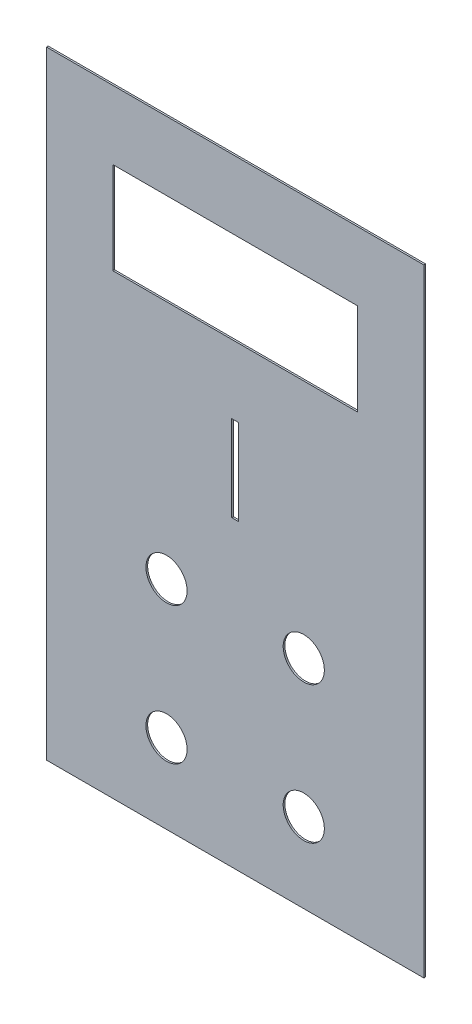
ISO-10303-21;
HEADER;
FILE_DESCRIPTION(('STEP AP214'),'2;1');
FILE_NAME('part.step','',(''),(''),'','','');
FILE_SCHEMA(('AUTOMOTIVE_DESIGN { 1 0 10303 214 1 1 1 1 }'));
ENDSEC;
DATA;
#1=APPLICATION_CONTEXT('core data for automotive mechanical design processes');
#2=APPLICATION_PROTOCOL_DEFINITION('international standard','automotive_design',2000,#1);
#3=PRODUCT_CONTEXT('',#1,'mechanical');
#4=PRODUCT('Part','Part','',(#3));
#5=PRODUCT_RELATED_PRODUCT_CATEGORY('part','',(#4));
#6=PRODUCT_DEFINITION_FORMATION('','',#4);
#7=PRODUCT_DEFINITION_CONTEXT('part definition',#1,'design');
#8=PRODUCT_DEFINITION('design','',#6,#7);
#9=PRODUCT_DEFINITION_SHAPE('','',#8);
#10=(LENGTH_UNIT() NAMED_UNIT(*) SI_UNIT(.MILLI.,.METRE.));
#11=(NAMED_UNIT(*) PLANE_ANGLE_UNIT() SI_UNIT($,.RADIAN.));
#12=(NAMED_UNIT(*) SI_UNIT($,.STERADIAN.) SOLID_ANGLE_UNIT());
#13=UNCERTAINTY_MEASURE_WITH_UNIT(LENGTH_MEASURE(1.E-05),#10,'distance_accuracy_value','');
#14=(GEOMETRIC_REPRESENTATION_CONTEXT(3) GLOBAL_UNCERTAINTY_ASSIGNED_CONTEXT((#13)) GLOBAL_UNIT_ASSIGNED_CONTEXT((#10,
#11,#12)) REPRESENTATION_CONTEXT('',''));
#15=CARTESIAN_POINT('',(0.,0.,0.));
#16=DIRECTION('',(0.,0.,1.));
#17=DIRECTION('',(1.,0.,0.));
#18=AXIS2_PLACEMENT_3D('',#15,#16,#17);
#19=CARTESIAN_POINT('',(55.,-90.,0.5));
#20=DIRECTION('',(-1.,0.,0.));
#21=DIRECTION('',(0.,0.,1.));
#22=AXIS2_PLACEMENT_3D('',#19,#20,#21);
#23=PLANE('',#22);
#24=DIRECTION('',(0.,1.,0.));
#25=VECTOR('',#24,1.);
#26=CARTESIAN_POINT('',(55.,-90.,0.));
#27=LINE('',#26,#25);
#28=CARTESIAN_POINT('',(55.,-90.,0.));
#29=VERTEX_POINT('',#28);
#30=CARTESIAN_POINT('',(55.,90.,0.));
#31=VERTEX_POINT('',#30);
#32=EDGE_CURVE('E175',#29,#31,#27,.T.);
#33=ORIENTED_EDGE('',*,*,#32,.T.);
#34=DIRECTION('',(0.,0.,-1.));
#35=VECTOR('',#34,1.);
#36=CARTESIAN_POINT('',(55.,90.,0.5));
#37=LINE('',#36,#35);
#38=CARTESIAN_POINT('',(55.,90.,0.5));
#39=VERTEX_POINT('',#38);
#40=EDGE_CURVE('E11',#39,#31,#37,.T.);
#41=ORIENTED_EDGE('',*,*,#40,.F.);
#42=DIRECTION('',(0.,1.,0.));
#43=VECTOR('',#42,1.);
#44=CARTESIAN_POINT('',(55.,-90.,0.5));
#45=LINE('',#44,#43);
#46=CARTESIAN_POINT('',(55.,-90.,0.5));
#47=VERTEX_POINT('',#46);
#48=EDGE_CURVE('E253',#47,#39,#45,.T.);
#49=ORIENTED_EDGE('',*,*,#48,.F.);
#50=DIRECTION('',(0.,0.,-1.));
#51=VECTOR('',#50,1.);
#52=CARTESIAN_POINT('',(55.,-90.,0.5));
#53=LINE('',#52,#51);
#54=EDGE_CURVE('E267',#47,#29,#53,.T.);
#55=ORIENTED_EDGE('',*,*,#54,.T.);
#56=EDGE_LOOP('',(#33,#41,#49,#55));
#57=FACE_BOUND('',#56,.T.);
#58=ADVANCED_FACE('F38',(#57),#23,.F.);
#59=CARTESIAN_POINT('',(-55.,90.,0.5));
#60=DIRECTION('',(0.,-1.,0.));
#61=DIRECTION('',(0.,0.,-1.));
#62=AXIS2_PLACEMENT_3D('',#59,#60,#61);
#63=PLANE('',#62);
#64=DIRECTION('',(-1.,0.,0.));
#65=VECTOR('',#64,1.);
#66=CARTESIAN_POINT('',(-55.,90.,0.));
#67=LINE('',#66,#65);
#68=CARTESIAN_POINT('',(-55.,90.,0.));
#69=VERTEX_POINT('',#68);
#70=EDGE_CURVE('E271',#31,#69,#67,.T.);
#71=ORIENTED_EDGE('',*,*,#70,.T.);
#72=DIRECTION('',(0.,0.,-1.));
#73=VECTOR('',#72,1.);
#74=CARTESIAN_POINT('',(-55.,90.,0.5));
#75=LINE('',#74,#73);
#76=CARTESIAN_POINT('',(-55.,90.,0.5));
#77=VERTEX_POINT('',#76);
#78=EDGE_CURVE('E46',#77,#69,#75,.T.);
#79=ORIENTED_EDGE('',*,*,#78,.F.);
#80=DIRECTION('',(-1.,0.,0.));
#81=VECTOR('',#80,1.);
#82=CARTESIAN_POINT('',(-55.,90.,0.5));
#83=LINE('',#82,#81);
#84=EDGE_CURVE('E257',#39,#77,#83,.T.);
#85=ORIENTED_EDGE('',*,*,#84,.F.);
#86=ORIENTED_EDGE('',*,*,#40,.T.);
#87=EDGE_LOOP('',(#71,#79,#85,#86));
#88=FACE_BOUND('',#87,.T.);
#89=ADVANCED_FACE('F306',(#88),#63,.F.);
#90=CARTESIAN_POINT('',(-55.,-90.,0.5));
#91=DIRECTION('',(1.,0.,0.));
#92=DIRECTION('',(0.,0.,-1.));
#93=AXIS2_PLACEMENT_3D('',#90,#91,#92);
#94=PLANE('',#93);
#95=DIRECTION('',(0.,-1.,0.));
#96=VECTOR('',#95,1.);
#97=CARTESIAN_POINT('',(-55.,-90.,0.));
#98=LINE('',#97,#96);
#99=CARTESIAN_POINT('',(-55.,-90.,0.));
#100=VERTEX_POINT('',#99);
#101=EDGE_CURVE('E274',#69,#100,#98,.T.);
#102=ORIENTED_EDGE('',*,*,#101,.T.);
#103=DIRECTION('',(0.,0.,-1.));
#104=VECTOR('',#103,1.);
#105=CARTESIAN_POINT('',(-55.,-90.,0.5));
#106=LINE('',#105,#104);
#107=CARTESIAN_POINT('',(-55.,-90.,0.5));
#108=VERTEX_POINT('',#107);
#109=EDGE_CURVE('E282',#108,#100,#106,.T.);
#110=ORIENTED_EDGE('',*,*,#109,.F.);
#111=DIRECTION('',(0.,-1.,0.));
#112=VECTOR('',#111,1.);
#113=CARTESIAN_POINT('',(-55.,-90.,0.5));
#114=LINE('',#113,#112);
#115=EDGE_CURVE('E261',#77,#108,#114,.T.);
#116=ORIENTED_EDGE('',*,*,#115,.F.);
#117=ORIENTED_EDGE('',*,*,#78,.T.);
#118=EDGE_LOOP('',(#102,#110,#116,#117));
#119=FACE_BOUND('',#118,.T.);
#120=ADVANCED_FACE('F291',(#119),#94,.F.);
#121=CARTESIAN_POINT('',(-55.,-90.,0.5));
#122=DIRECTION('',(0.,1.,0.));
#123=DIRECTION('',(0.,0.,1.));
#124=AXIS2_PLACEMENT_3D('',#121,#122,#123);
#125=PLANE('',#124);
#126=DIRECTION('',(1.,0.,0.));
#127=VECTOR('',#126,1.);
#128=CARTESIAN_POINT('',(-55.,-90.,0.));
#129=LINE('',#128,#127);
#130=EDGE_CURVE('E258',#100,#29,#129,.T.);
#131=ORIENTED_EDGE('',*,*,#130,.T.);
#132=ORIENTED_EDGE('',*,*,#54,.F.);
#133=DIRECTION('',(1.,0.,0.));
#134=VECTOR('',#133,1.);
#135=CARTESIAN_POINT('',(-55.,-90.,0.5));
#136=LINE('',#135,#134);
#137=EDGE_CURVE('E264',#108,#47,#136,.T.);
#138=ORIENTED_EDGE('',*,*,#137,.F.);
#139=ORIENTED_EDGE('',*,*,#109,.T.);
#140=EDGE_LOOP('',(#131,#132,#138,#139));
#141=FACE_BOUND('',#140,.T.);
#142=ADVANCED_FACE('F299',(#141),#125,.F.);
#143=CARTESIAN_POINT('',(0.,0.,0.5));
#144=DIRECTION('',(0.,0.,-1.));
#145=DIRECTION('',(-1.,0.,0.));
#146=AXIS2_PLACEMENT_3D('',#143,#144,#145);
#147=PLANE('',#146);
#148=DIRECTION('',(-1.,0.,0.));
#149=VECTOR('',#148,1.);
#150=CARTESIAN_POINT('',(-35.65,70.,0.5));
#151=LINE('',#150,#149);
#152=CARTESIAN_POINT('',(35.65,70.,0.5));
#153=VERTEX_POINT('',#152);
#154=CARTESIAN_POINT('',(-35.65,70.,0.5));
#155=VERTEX_POINT('',#154);
#156=EDGE_CURVE('E165',#153,#155,#151,.T.);
#157=ORIENTED_EDGE('',*,*,#156,.F.);
#158=DIRECTION('',(0.,1.,0.));
#159=VECTOR('',#158,1.);
#160=CARTESIAN_POINT('',(35.65,43.2,0.5));
#161=LINE('',#160,#159);
#162=CARTESIAN_POINT('',(35.65,43.2,0.5));
#163=VERTEX_POINT('',#162);
#164=EDGE_CURVE('E53',#163,#153,#161,.T.);
#165=ORIENTED_EDGE('',*,*,#164,.F.);
#166=DIRECTION('',(1.,0.,0.));
#167=VECTOR('',#166,1.);
#168=CARTESIAN_POINT('',(-35.65,43.2,0.5));
#169=LINE('',#168,#167);
#170=CARTESIAN_POINT('',(-35.65,43.2,0.5));
#171=VERTEX_POINT('',#170);
#172=EDGE_CURVE('E151',#171,#163,#169,.T.);
#173=ORIENTED_EDGE('',*,*,#172,.F.);
#174=DIRECTION('',(0.,-1.,0.));
#175=VECTOR('',#174,1.);
#176=CARTESIAN_POINT('',(-35.65,43.2,0.5));
#177=LINE('',#176,#175);
#178=EDGE_CURVE('E156',#155,#171,#177,.T.);
#179=ORIENTED_EDGE('',*,*,#178,.F.);
#180=EDGE_LOOP('',(#157,#165,#173,#179));
#181=FACE_BOUND('',#180,.T.);
#182=CARTESIAN_POINT('',(-20.,-66.8,0.5));
#183=DIRECTION('',(0.,0.,1.));
#184=DIRECTION('',(1.,0.,0.));
#185=AXIS2_PLACEMENT_3D('',#182,#183,#184);
#186=CIRCLE('',#185,6.00000000000001);
#187=CARTESIAN_POINT('',(-14.,-66.8,0.5));
#188=VERTEX_POINT('',#187);
#189=EDGE_CURVE('E186',#188,#188,#186,.T.);
#190=ORIENTED_EDGE('',*,*,#189,.F.);
#191=EDGE_LOOP('',(#190));
#192=FACE_BOUND('',#191,.T.);
#193=CARTESIAN_POINT('',(20.,-66.8,0.5));
#194=DIRECTION('',(0.,0.,1.));
#195=DIRECTION('',(1.,0.,0.));
#196=AXIS2_PLACEMENT_3D('',#193,#194,#195);
#197=CIRCLE('',#196,6.);
#198=CARTESIAN_POINT('',(26.,-66.8,0.5));
#199=VERTEX_POINT('',#198);
#200=EDGE_CURVE('E185',#199,#199,#197,.T.);
#201=ORIENTED_EDGE('',*,*,#200,.F.);
#202=EDGE_LOOP('',(#201));
#203=FACE_BOUND('',#202,.T.);
#204=CARTESIAN_POINT('',(20.,-26.8,0.5));
#205=DIRECTION('',(0.,0.,1.));
#206=DIRECTION('',(1.,0.,0.));
#207=AXIS2_PLACEMENT_3D('',#204,#205,#206);
#208=CIRCLE('',#207,6.);
#209=CARTESIAN_POINT('',(26.,-26.8,0.5));
#210=VERTEX_POINT('',#209);
#211=EDGE_CURVE('E243',#210,#210,#208,.T.);
#212=ORIENTED_EDGE('',*,*,#211,.F.);
#213=EDGE_LOOP('',(#212));
#214=FACE_BOUND('',#213,.T.);
#215=CARTESIAN_POINT('',(-20.,-26.8,0.5));
#216=DIRECTION('',(0.,0.,1.));
#217=DIRECTION('',(1.,0.,0.));
#218=AXIS2_PLACEMENT_3D('',#215,#216,#217);
#219=CIRCLE('',#218,6.);
#220=CARTESIAN_POINT('',(-14.,-26.8,0.5));
#221=VERTEX_POINT('',#220);
#222=EDGE_CURVE('E235',#221,#221,#219,.T.);
#223=ORIENTED_EDGE('',*,*,#222,.F.);
#224=EDGE_LOOP('',(#223));
#225=FACE_BOUND('',#224,.T.);
#226=DIRECTION('',(-1.,0.,0.));
#227=VECTOR('',#226,1.);
#228=CARTESIAN_POINT('',(-0.999999999999993,23.2,0.5));
#229=LINE('',#228,#227);
#230=CARTESIAN_POINT('',(1.00000000000001,23.2,0.5));
#231=VERTEX_POINT('',#230);
#232=CARTESIAN_POINT('',(-0.999999999999993,23.2,0.5));
#233=VERTEX_POINT('',#232);
#234=EDGE_CURVE('E210',#231,#233,#229,.T.);
#235=ORIENTED_EDGE('',*,*,#234,.F.);
#236=DIRECTION('',(0.,1.,0.));
#237=VECTOR('',#236,1.);
#238=CARTESIAN_POINT('',(1.00000000000001,-1.8,0.5));
#239=LINE('',#238,#237);
#240=CARTESIAN_POINT('',(1.00000000000001,-1.8,0.5));
#241=VERTEX_POINT('',#240);
#242=EDGE_CURVE('E61',#241,#231,#239,.T.);
#243=ORIENTED_EDGE('',*,*,#242,.F.);
#244=DIRECTION('',(1.,0.,0.));
#245=VECTOR('',#244,1.);
#246=CARTESIAN_POINT('',(-0.999999999999993,-1.8,0.5));
#247=LINE('',#246,#245);
#248=CARTESIAN_POINT('',(-0.999999999999993,-1.8,0.5));
#249=VERTEX_POINT('',#248);
#250=EDGE_CURVE('E195',#249,#241,#247,.T.);
#251=ORIENTED_EDGE('',*,*,#250,.F.);
#252=DIRECTION('',(0.,-1.,0.));
#253=VECTOR('',#252,1.);
#254=CARTESIAN_POINT('',(-0.999999999999993,-1.8,0.5));
#255=LINE('',#254,#253);
#256=EDGE_CURVE('E215',#233,#249,#255,.T.);
#257=ORIENTED_EDGE('',*,*,#256,.F.);
#258=EDGE_LOOP('',(#235,#243,#251,#257));
#259=FACE_BOUND('',#258,.T.);
#260=ORIENTED_EDGE('',*,*,#48,.T.);
#261=ORIENTED_EDGE('',*,*,#84,.T.);
#262=ORIENTED_EDGE('',*,*,#115,.T.);
#263=ORIENTED_EDGE('',*,*,#137,.T.);
#264=EDGE_LOOP('',(#260,#261,#262,#263));
#265=FACE_BOUND('',#264,.T.);
#266=ADVANCED_FACE('F305',(#181,#192,#203,#214,#225,#259,#265),#147,.F.);
#267=CARTESIAN_POINT('',(0.,0.,0.));
#268=DIRECTION('',(0.,0.,-1.));
#269=DIRECTION('',(-1.,0.,0.));
#270=AXIS2_PLACEMENT_3D('',#267,#268,#269);
#271=PLANE('',#270);
#272=DIRECTION('',(0.,1.,0.));
#273=VECTOR('',#272,1.);
#274=CARTESIAN_POINT('',(35.65,43.2,0.));
#275=LINE('',#274,#273);
#276=CARTESIAN_POINT('',(35.65,43.2,0.));
#277=VERTEX_POINT('',#276);
#278=CARTESIAN_POINT('',(35.65,70.,0.));
#279=VERTEX_POINT('',#278);
#280=EDGE_CURVE('E129',#277,#279,#275,.T.);
#281=ORIENTED_EDGE('',*,*,#280,.T.);
#282=DIRECTION('',(-1.,0.,0.));
#283=VECTOR('',#282,1.);
#284=CARTESIAN_POINT('',(-35.65,70.,0.));
#285=LINE('',#284,#283);
#286=CARTESIAN_POINT('',(-35.65,70.,0.));
#287=VERTEX_POINT('',#286);
#288=EDGE_CURVE('E140',#279,#287,#285,.T.);
#289=ORIENTED_EDGE('',*,*,#288,.T.);
#290=DIRECTION('',(0.,-1.,0.));
#291=VECTOR('',#290,1.);
#292=CARTESIAN_POINT('',(-35.65,43.2,0.));
#293=LINE('',#292,#291);
#294=CARTESIAN_POINT('',(-35.65,43.2,0.));
#295=VERTEX_POINT('',#294);
#296=EDGE_CURVE('E145',#287,#295,#293,.T.);
#297=ORIENTED_EDGE('',*,*,#296,.T.);
#298=DIRECTION('',(1.,0.,0.));
#299=VECTOR('',#298,1.);
#300=CARTESIAN_POINT('',(-35.65,43.2,0.));
#301=LINE('',#300,#299);
#302=EDGE_CURVE('E136',#295,#277,#301,.T.);
#303=ORIENTED_EDGE('',*,*,#302,.T.);
#304=EDGE_LOOP('',(#281,#289,#297,#303));
#305=FACE_BOUND('',#304,.T.);
#306=CARTESIAN_POINT('',(-20.,-66.8,0.));
#307=DIRECTION('',(0.,0.,1.));
#308=DIRECTION('',(1.,0.,0.));
#309=AXIS2_PLACEMENT_3D('',#306,#307,#308);
#310=CIRCLE('',#309,6.00000000000001);
#311=CARTESIAN_POINT('',(-14.,-66.8,0.));
#312=VERTEX_POINT('',#311);
#313=EDGE_CURVE('E181',#312,#312,#310,.T.);
#314=ORIENTED_EDGE('',*,*,#313,.T.);
#315=EDGE_LOOP('',(#314));
#316=FACE_BOUND('',#315,.T.);
#317=CARTESIAN_POINT('',(20.,-66.8,0.));
#318=DIRECTION('',(0.,0.,1.));
#319=DIRECTION('',(1.,0.,0.));
#320=AXIS2_PLACEMENT_3D('',#317,#318,#319);
#321=CIRCLE('',#320,6.);
#322=CARTESIAN_POINT('',(26.,-66.8,0.));
#323=VERTEX_POINT('',#322);
#324=EDGE_CURVE('E247',#323,#323,#321,.T.);
#325=ORIENTED_EDGE('',*,*,#324,.T.);
#326=EDGE_LOOP('',(#325));
#327=FACE_BOUND('',#326,.T.);
#328=CARTESIAN_POINT('',(20.,-26.8,0.));
#329=DIRECTION('',(0.,0.,1.));
#330=DIRECTION('',(1.,0.,0.));
#331=AXIS2_PLACEMENT_3D('',#328,#329,#330);
#332=CIRCLE('',#331,6.);
#333=CARTESIAN_POINT('',(26.,-26.8,0.));
#334=VERTEX_POINT('',#333);
#335=EDGE_CURVE('E239',#334,#334,#332,.T.);
#336=ORIENTED_EDGE('',*,*,#335,.T.);
#337=EDGE_LOOP('',(#336));
#338=FACE_BOUND('',#337,.T.);
#339=CARTESIAN_POINT('',(-20.,-26.8,0.));
#340=DIRECTION('',(0.,0.,1.));
#341=DIRECTION('',(1.,0.,0.));
#342=AXIS2_PLACEMENT_3D('',#339,#340,#341);
#343=CIRCLE('',#342,6.);
#344=CARTESIAN_POINT('',(-14.,-26.8,0.));
#345=VERTEX_POINT('',#344);
#346=EDGE_CURVE('E211',#345,#345,#343,.T.);
#347=ORIENTED_EDGE('',*,*,#346,.T.);
#348=EDGE_LOOP('',(#347));
#349=FACE_BOUND('',#348,.T.);
#350=DIRECTION('',(0.,1.,0.));
#351=VECTOR('',#350,1.);
#352=CARTESIAN_POINT('',(1.00000000000001,-1.8,0.));
#353=LINE('',#352,#351);
#354=CARTESIAN_POINT('',(1.00000000000001,-1.8,0.));
#355=VERTEX_POINT('',#354);
#356=CARTESIAN_POINT('',(1.00000000000001,23.2,0.));
#357=VERTEX_POINT('',#356);
#358=EDGE_CURVE('E190',#355,#357,#353,.T.);
#359=ORIENTED_EDGE('',*,*,#358,.T.);
#360=DIRECTION('',(-1.,0.,0.));
#361=VECTOR('',#360,1.);
#362=CARTESIAN_POINT('',(-0.999999999999993,23.2,0.));
#363=LINE('',#362,#361);
#364=CARTESIAN_POINT('',(-0.999999999999993,23.2,0.));
#365=VERTEX_POINT('',#364);
#366=EDGE_CURVE('E194',#357,#365,#363,.T.);
#367=ORIENTED_EDGE('',*,*,#366,.T.);
#368=DIRECTION('',(0.,-1.,0.));
#369=VECTOR('',#368,1.);
#370=CARTESIAN_POINT('',(-0.999999999999993,-1.8,0.));
#371=LINE('',#370,#369);
#372=CARTESIAN_POINT('',(-0.999999999999993,-1.8,0.));
#373=VERTEX_POINT('',#372);
#374=EDGE_CURVE('E199',#365,#373,#371,.T.);
#375=ORIENTED_EDGE('',*,*,#374,.T.);
#376=DIRECTION('',(1.,0.,0.));
#377=VECTOR('',#376,1.);
#378=CARTESIAN_POINT('',(-0.999999999999993,-1.8,0.));
#379=LINE('',#378,#377);
#380=EDGE_CURVE('E203',#373,#355,#379,.T.);
#381=ORIENTED_EDGE('',*,*,#380,.T.);
#382=EDGE_LOOP('',(#359,#367,#375,#381));
#383=FACE_BOUND('',#382,.T.);
#384=ORIENTED_EDGE('',*,*,#32,.F.);
#385=ORIENTED_EDGE('',*,*,#130,.F.);
#386=ORIENTED_EDGE('',*,*,#101,.F.);
#387=ORIENTED_EDGE('',*,*,#70,.F.);
#388=EDGE_LOOP('',(#384,#385,#386,#387));
#389=FACE_BOUND('',#388,.T.);
#390=ADVANCED_FACE('F147',(#305,#316,#327,#338,#349,#383,#389),#271,.T.);
#391=CARTESIAN_POINT('',(1.00000000000001,-1.8,0.));
#392=DIRECTION('',(1.,0.,0.));
#393=DIRECTION('',(0.,0.,-1.));
#394=AXIS2_PLACEMENT_3D('',#391,#392,#393);
#395=PLANE('',#394);
#396=ORIENTED_EDGE('',*,*,#242,.T.);
#397=DIRECTION('',(0.,0.,1.));
#398=VECTOR('',#397,1.);
#399=CARTESIAN_POINT('',(1.00000000000001,23.2,0.));
#400=LINE('',#399,#398);
#401=EDGE_CURVE('E207',#357,#231,#400,.T.);
#402=ORIENTED_EDGE('',*,*,#401,.F.);
#403=ORIENTED_EDGE('',*,*,#358,.F.);
#404=DIRECTION('',(0.,0.,1.));
#405=VECTOR('',#404,1.);
#406=CARTESIAN_POINT('',(1.00000000000001,-1.8,0.));
#407=LINE('',#406,#405);
#408=EDGE_CURVE('E166',#355,#241,#407,.T.);
#409=ORIENTED_EDGE('',*,*,#408,.T.);
#410=EDGE_LOOP('',(#396,#402,#403,#409));
#411=FACE_BOUND('',#410,.T.);
#412=ADVANCED_FACE('F318',(#411),#395,.F.);
#413=CARTESIAN_POINT('',(-0.999999999999993,-1.8,0.));
#414=DIRECTION('',(0.,-1.,0.));
#415=DIRECTION('',(0.,0.,-1.));
#416=AXIS2_PLACEMENT_3D('',#413,#414,#415);
#417=PLANE('',#416);
#418=ORIENTED_EDGE('',*,*,#250,.T.);
#419=ORIENTED_EDGE('',*,*,#408,.F.);
#420=ORIENTED_EDGE('',*,*,#380,.F.);
#421=DIRECTION('',(0.,0.,1.));
#422=VECTOR('',#421,1.);
#423=CARTESIAN_POINT('',(-0.999999999999993,-1.8,0.));
#424=LINE('',#423,#422);
#425=EDGE_CURVE('E224',#373,#249,#424,.T.);
#426=ORIENTED_EDGE('',*,*,#425,.T.);
#427=EDGE_LOOP('',(#418,#419,#420,#426));
#428=FACE_BOUND('',#427,.T.);
#429=ADVANCED_FACE('F338',(#428),#417,.F.);
#430=CARTESIAN_POINT('',(-0.999999999999993,-1.8,0.));
#431=DIRECTION('',(-1.,0.,0.));
#432=DIRECTION('',(0.,0.,1.));
#433=AXIS2_PLACEMENT_3D('',#430,#431,#432);
#434=PLANE('',#433);
#435=ORIENTED_EDGE('',*,*,#256,.T.);
#436=ORIENTED_EDGE('',*,*,#425,.F.);
#437=ORIENTED_EDGE('',*,*,#374,.F.);
#438=DIRECTION('',(0.,0.,1.));
#439=VECTOR('',#438,1.);
#440=CARTESIAN_POINT('',(-0.999999999999993,23.2,0.));
#441=LINE('',#440,#439);
#442=EDGE_CURVE('E227',#365,#233,#441,.T.);
#443=ORIENTED_EDGE('',*,*,#442,.T.);
#444=EDGE_LOOP('',(#435,#436,#437,#443));
#445=FACE_BOUND('',#444,.T.);
#446=ADVANCED_FACE('F341',(#445),#434,.F.);
#447=CARTESIAN_POINT('',(-0.999999999999993,23.2,0.));
#448=DIRECTION('',(0.,1.,0.));
#449=DIRECTION('',(0.,0.,1.));
#450=AXIS2_PLACEMENT_3D('',#447,#448,#449);
#451=PLANE('',#450);
#452=ORIENTED_EDGE('',*,*,#234,.T.);
#453=ORIENTED_EDGE('',*,*,#442,.F.);
#454=ORIENTED_EDGE('',*,*,#366,.F.);
#455=ORIENTED_EDGE('',*,*,#401,.T.);
#456=EDGE_LOOP('',(#452,#453,#454,#455));
#457=FACE_BOUND('',#456,.T.);
#458=ADVANCED_FACE('F334',(#457),#451,.F.);
#459=CARTESIAN_POINT('',(-20.,-26.8,0.));
#460=DIRECTION('',(0.,0.,1.));
#461=DIRECTION('',(1.,0.,0.));
#462=AXIS2_PLACEMENT_3D('',#459,#460,#461);
#463=CYLINDRICAL_SURFACE('',#462,6.);
#464=ORIENTED_EDGE('',*,*,#346,.F.);
#465=EDGE_LOOP('',(#464));
#466=FACE_BOUND('',#465,.T.);
#467=ORIENTED_EDGE('',*,*,#222,.T.);
#468=EDGE_LOOP('',(#467));
#469=FACE_BOUND('',#468,.T.);
#470=ADVANCED_FACE('F330',(#466,#469),#463,.F.);
#471=CARTESIAN_POINT('',(20.,-26.8,0.));
#472=DIRECTION('',(0.,0.,1.));
#473=DIRECTION('',(1.,0.,0.));
#474=AXIS2_PLACEMENT_3D('',#471,#472,#473);
#475=CYLINDRICAL_SURFACE('',#474,6.);
#476=ORIENTED_EDGE('',*,*,#335,.F.);
#477=EDGE_LOOP('',(#476));
#478=FACE_BOUND('',#477,.T.);
#479=ORIENTED_EDGE('',*,*,#211,.T.);
#480=EDGE_LOOP('',(#479));
#481=FACE_BOUND('',#480,.T.);
#482=ADVANCED_FACE('F326',(#478,#481),#475,.F.);
#483=CARTESIAN_POINT('',(20.,-66.8,0.));
#484=DIRECTION('',(0.,0.,1.));
#485=DIRECTION('',(1.,0.,0.));
#486=AXIS2_PLACEMENT_3D('',#483,#484,#485);
#487=CYLINDRICAL_SURFACE('',#486,6.);
#488=ORIENTED_EDGE('',*,*,#324,.F.);
#489=EDGE_LOOP('',(#488));
#490=FACE_BOUND('',#489,.T.);
#491=ORIENTED_EDGE('',*,*,#200,.T.);
#492=EDGE_LOOP('',(#491));
#493=FACE_BOUND('',#492,.T.);
#494=ADVANCED_FACE('F322',(#490,#493),#487,.F.);
#495=CARTESIAN_POINT('',(-20.,-66.8,0.));
#496=DIRECTION('',(0.,0.,1.));
#497=DIRECTION('',(1.,0.,0.));
#498=AXIS2_PLACEMENT_3D('',#495,#496,#497);
#499=CYLINDRICAL_SURFACE('',#498,6.00000000000001);
#500=ORIENTED_EDGE('',*,*,#313,.F.);
#501=EDGE_LOOP('',(#500));
#502=FACE_BOUND('',#501,.T.);
#503=ORIENTED_EDGE('',*,*,#189,.T.);
#504=EDGE_LOOP('',(#503));
#505=FACE_BOUND('',#504,.T.);
#506=ADVANCED_FACE('F325',(#502,#505),#499,.F.);
#507=CARTESIAN_POINT('',(35.65,43.2,0.));
#508=DIRECTION('',(1.,0.,0.));
#509=DIRECTION('',(0.,0.,-1.));
#510=AXIS2_PLACEMENT_3D('',#507,#508,#509);
#511=PLANE('',#510);
#512=ORIENTED_EDGE('',*,*,#164,.T.);
#513=DIRECTION('',(0.,0.,1.));
#514=VECTOR('',#513,1.);
#515=CARTESIAN_POINT('',(35.65,70.,0.));
#516=LINE('',#515,#514);
#517=EDGE_CURVE('E125',#279,#153,#516,.T.);
#518=ORIENTED_EDGE('',*,*,#517,.F.);
#519=ORIENTED_EDGE('',*,*,#280,.F.);
#520=DIRECTION('',(0.,0.,1.));
#521=VECTOR('',#520,1.);
#522=CARTESIAN_POINT('',(35.65,43.2,0.));
#523=LINE('',#522,#521);
#524=EDGE_CURVE('E172',#277,#163,#523,.T.);
#525=ORIENTED_EDGE('',*,*,#524,.T.);
#526=EDGE_LOOP('',(#512,#518,#519,#525));
#527=FACE_BOUND('',#526,.T.);
#528=ADVANCED_FACE('F127',(#527),#511,.F.);
#529=CARTESIAN_POINT('',(-35.65,43.2,0.));
#530=DIRECTION('',(0.,-1.,0.));
#531=DIRECTION('',(0.,0.,-1.));
#532=AXIS2_PLACEMENT_3D('',#529,#530,#531);
#533=PLANE('',#532);
#534=ORIENTED_EDGE('',*,*,#172,.T.);
#535=ORIENTED_EDGE('',*,*,#524,.F.);
#536=ORIENTED_EDGE('',*,*,#302,.F.);
#537=DIRECTION('',(0.,0.,1.));
#538=VECTOR('',#537,1.);
#539=CARTESIAN_POINT('',(-35.65,43.2,0.));
#540=LINE('',#539,#538);
#541=EDGE_CURVE('E176',#295,#171,#540,.T.);
#542=ORIENTED_EDGE('',*,*,#541,.T.);
#543=EDGE_LOOP('',(#534,#535,#536,#542));
#544=FACE_BOUND('',#543,.T.);
#545=ADVANCED_FACE('F354',(#544),#533,.F.);
#546=CARTESIAN_POINT('',(-35.65,43.2,0.));
#547=DIRECTION('',(-1.,0.,0.));
#548=DIRECTION('',(0.,0.,1.));
#549=AXIS2_PLACEMENT_3D('',#546,#547,#548);
#550=PLANE('',#549);
#551=ORIENTED_EDGE('',*,*,#178,.T.);
#552=ORIENTED_EDGE('',*,*,#541,.F.);
#553=ORIENTED_EDGE('',*,*,#296,.F.);
#554=DIRECTION('',(0.,0.,1.));
#555=VECTOR('',#554,1.);
#556=CARTESIAN_POINT('',(-35.65,70.,0.));
#557=LINE('',#556,#555);
#558=EDGE_CURVE('E135',#287,#155,#557,.T.);
#559=ORIENTED_EDGE('',*,*,#558,.T.);
#560=EDGE_LOOP('',(#551,#552,#553,#559));
#561=FACE_BOUND('',#560,.T.);
#562=ADVANCED_FACE('F357',(#561),#550,.F.);
#563=CARTESIAN_POINT('',(-35.65,70.,0.));
#564=DIRECTION('',(0.,1.,0.));
#565=DIRECTION('',(0.,0.,1.));
#566=AXIS2_PLACEMENT_3D('',#563,#564,#565);
#567=PLANE('',#566);
#568=ORIENTED_EDGE('',*,*,#156,.T.);
#569=ORIENTED_EDGE('',*,*,#558,.F.);
#570=ORIENTED_EDGE('',*,*,#288,.F.);
#571=ORIENTED_EDGE('',*,*,#517,.T.);
#572=EDGE_LOOP('',(#568,#569,#570,#571));
#573=FACE_BOUND('',#572,.T.);
#574=ADVANCED_FACE('F141',(#573),#567,.F.);
#575=CLOSED_SHELL('',(#58,#89,#120,#142,#266,#390,#412,#429,#446,#458,#470,#482,#494,#506,#528,
#545,#562,#574));
#576=MANIFOLD_SOLID_BREP('B2',#575);
#577=ADVANCED_BREP_SHAPE_REPRESENTATION('',(#18,#576),#14);
#578=SHAPE_DEFINITION_REPRESENTATION(#9,#577);
ENDSEC;
END-ISO-10303-21;
